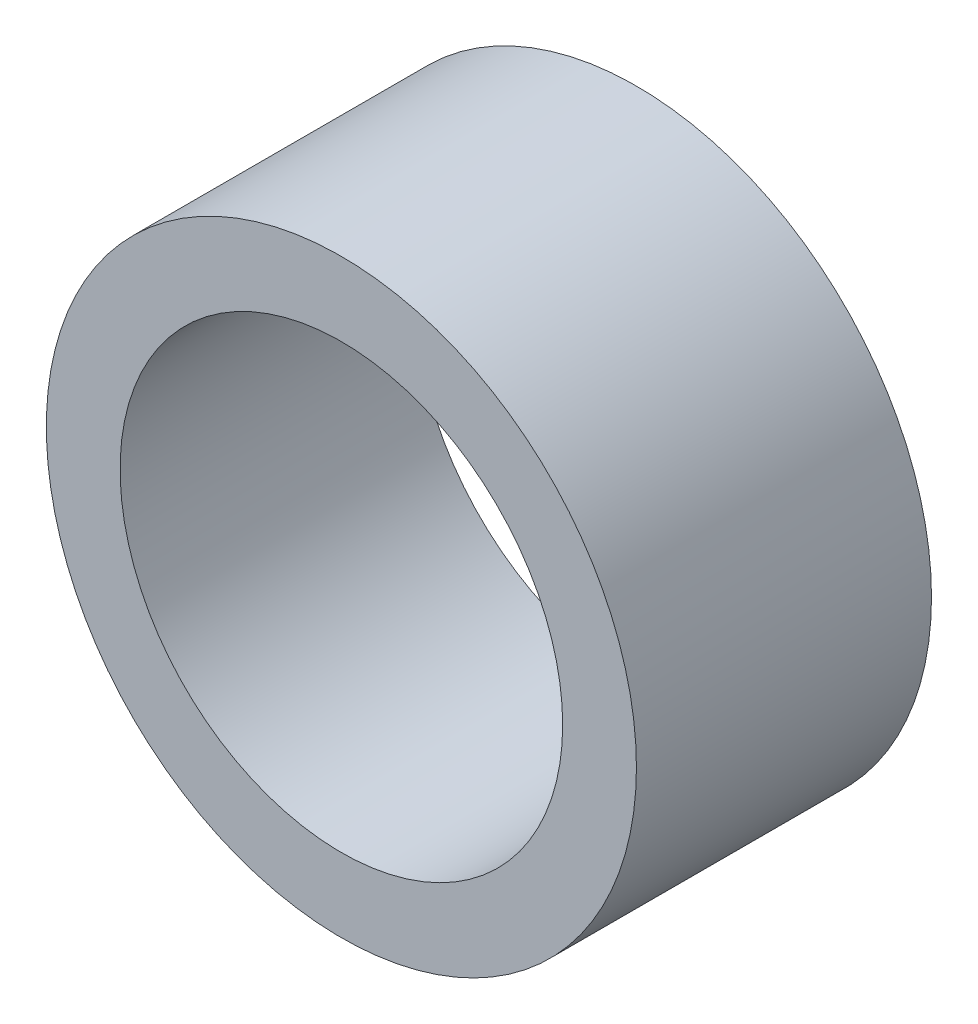
ISO-10303-21;
HEADER;
FILE_DESCRIPTION(('STEP AP214'),'2;1');
FILE_NAME('part.step','',(''),(''),'','','');
FILE_SCHEMA(('AUTOMOTIVE_DESIGN { 1 0 10303 214 1 1 1 1 }'));
ENDSEC;
DATA;
#1=APPLICATION_CONTEXT('core data for automotive mechanical design processes');
#2=APPLICATION_PROTOCOL_DEFINITION('international standard','automotive_design',2000,#1);
#3=PRODUCT_CONTEXT('',#1,'mechanical');
#4=PRODUCT('Part','Part','',(#3));
#5=PRODUCT_RELATED_PRODUCT_CATEGORY('part','',(#4));
#6=PRODUCT_DEFINITION_FORMATION('','',#4);
#7=PRODUCT_DEFINITION_CONTEXT('part definition',#1,'design');
#8=PRODUCT_DEFINITION('design','',#6,#7);
#9=PRODUCT_DEFINITION_SHAPE('','',#8);
#10=(LENGTH_UNIT() NAMED_UNIT(*) SI_UNIT(.MILLI.,.METRE.));
#11=(NAMED_UNIT(*) PLANE_ANGLE_UNIT() SI_UNIT($,.RADIAN.));
#12=(NAMED_UNIT(*) SI_UNIT($,.STERADIAN.) SOLID_ANGLE_UNIT());
#13=UNCERTAINTY_MEASURE_WITH_UNIT(LENGTH_MEASURE(1.E-05),#10,'distance_accuracy_value','');
#14=(GEOMETRIC_REPRESENTATION_CONTEXT(3) GLOBAL_UNCERTAINTY_ASSIGNED_CONTEXT((#13)) GLOBAL_UNIT_ASSIGNED_CONTEXT((#10,
#11,#12)) REPRESENTATION_CONTEXT('',''));
#15=CARTESIAN_POINT('',(0.,0.,0.));
#16=DIRECTION('',(0.,0.,1.));
#17=DIRECTION('',(1.,0.,0.));
#18=AXIS2_PLACEMENT_3D('',#15,#16,#17);
#19=CARTESIAN_POINT('',(0.,9.99999999999999,4.));
#20=DIRECTION('',(0.,0.,1.));
#21=DIRECTION('',(1.,0.,0.));
#22=AXIS2_PLACEMENT_3D('',#19,#20,#21);
#23=PLANE('',#22);
#24=CARTESIAN_POINT('',(0.,9.99999999999999,4.));
#25=DIRECTION('',(0.,0.,1.));
#26=DIRECTION('',(1.,0.,0.));
#27=AXIS2_PLACEMENT_3D('',#24,#25,#26);
#28=CIRCLE('',#27,4.);
#29=CARTESIAN_POINT('',(4.,9.99999999999999,4.));
#30=VERTEX_POINT('',#29);
#31=EDGE_CURVE('E10',#30,#30,#28,.T.);
#32=ORIENTED_EDGE('',*,*,#31,.T.);
#33=EDGE_LOOP('',(#32));
#34=FACE_BOUND('',#33,.T.);
#35=CARTESIAN_POINT('',(0.,9.99999999999999,4.));
#36=DIRECTION('',(0.,0.,1.));
#37=DIRECTION('',(1.,0.,0.));
#38=AXIS2_PLACEMENT_3D('',#35,#36,#37);
#39=CIRCLE('',#38,3.);
#40=CARTESIAN_POINT('',(3.,9.99999999999999,4.));
#41=VERTEX_POINT('',#40);
#42=EDGE_CURVE('E51',#41,#41,#39,.T.);
#43=ORIENTED_EDGE('',*,*,#42,.F.);
#44=EDGE_LOOP('',(#43));
#45=FACE_BOUND('',#44,.T.);
#46=ADVANCED_FACE('F40',(#34,#45),#23,.T.);
#47=CARTESIAN_POINT('',(0.,9.99999999999999,0.));
#48=DIRECTION('',(0.,0.,1.));
#49=DIRECTION('',(1.,0.,0.));
#50=AXIS2_PLACEMENT_3D('',#47,#48,#49);
#51=PLANE('',#50);
#52=CARTESIAN_POINT('',(0.,9.99999999999999,0.));
#53=DIRECTION('',(0.,0.,1.));
#54=DIRECTION('',(1.,0.,0.));
#55=AXIS2_PLACEMENT_3D('',#52,#53,#54);
#56=CIRCLE('',#55,4.);
#57=CARTESIAN_POINT('',(4.,9.99999999999999,0.));
#58=VERTEX_POINT('',#57);
#59=EDGE_CURVE('E44',#58,#58,#56,.T.);
#60=ORIENTED_EDGE('',*,*,#59,.F.);
#61=EDGE_LOOP('',(#60));
#62=FACE_BOUND('',#61,.T.);
#63=CARTESIAN_POINT('',(0.,9.99999999999999,0.));
#64=DIRECTION('',(0.,0.,1.));
#65=DIRECTION('',(1.,0.,0.));
#66=AXIS2_PLACEMENT_3D('',#63,#64,#65);
#67=CIRCLE('',#66,3.);
#68=CARTESIAN_POINT('',(3.,9.99999999999999,0.));
#69=VERTEX_POINT('',#68);
#70=EDGE_CURVE('E53',#69,#69,#67,.T.);
#71=ORIENTED_EDGE('',*,*,#70,.T.);
#72=EDGE_LOOP('',(#71));
#73=FACE_BOUND('',#72,.T.);
#74=ADVANCED_FACE('F63',(#62,#73),#51,.F.);
#75=CARTESIAN_POINT('',(0.,9.99999999999999,4.));
#76=DIRECTION('',(0.,0.,-1.));
#77=DIRECTION('',(-1.,0.,0.));
#78=AXIS2_PLACEMENT_3D('',#75,#76,#77);
#79=CYLINDRICAL_SURFACE('',#78,4.);
#80=ORIENTED_EDGE('',*,*,#31,.F.);
#81=EDGE_LOOP('',(#80));
#82=FACE_BOUND('',#81,.T.);
#83=ORIENTED_EDGE('',*,*,#59,.T.);
#84=EDGE_LOOP('',(#83));
#85=FACE_BOUND('',#84,.T.);
#86=ADVANCED_FACE('F42',(#82,#85),#79,.T.);
#87=CARTESIAN_POINT('',(0.,9.99999999999999,4.));
#88=DIRECTION('',(0.,0.,-1.));
#89=DIRECTION('',(-1.,0.,0.));
#90=AXIS2_PLACEMENT_3D('',#87,#88,#89);
#91=CYLINDRICAL_SURFACE('',#90,3.);
#92=ORIENTED_EDGE('',*,*,#42,.T.);
#93=EDGE_LOOP('',(#92));
#94=FACE_BOUND('',#93,.T.);
#95=ORIENTED_EDGE('',*,*,#70,.F.);
#96=EDGE_LOOP('',(#95));
#97=FACE_BOUND('',#96,.T.);
#98=ADVANCED_FACE('F59',(#94,#97),#91,.F.);
#99=CLOSED_SHELL('',(#46,#74,#86,#98));
#100=MANIFOLD_SOLID_BREP('B2',#99);
#101=ADVANCED_BREP_SHAPE_REPRESENTATION('',(#18,#100),#14);
#102=SHAPE_DEFINITION_REPRESENTATION(#9,#101);
ENDSEC;
END-ISO-10303-21;
